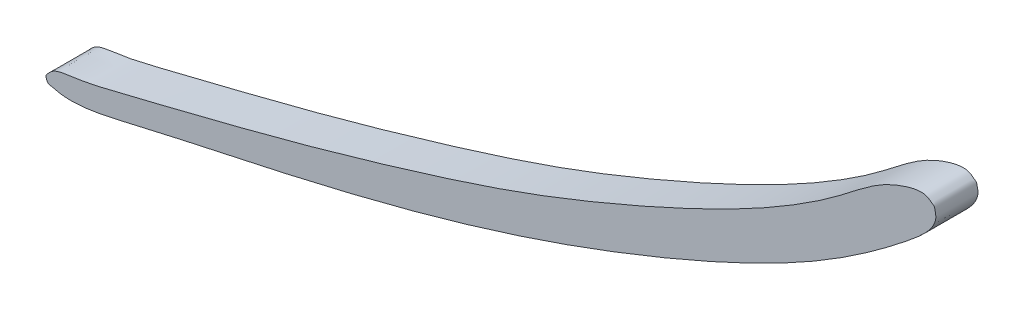
ISO-10303-21;
HEADER;
FILE_DESCRIPTION(('STEP AP214'),'2;1');
FILE_NAME('part.step','',(''),(''),'','','');
FILE_SCHEMA(('AUTOMOTIVE_DESIGN { 1 0 10303 214 1 1 1 1 }'));
ENDSEC;
DATA;
#1=APPLICATION_CONTEXT('core data for automotive mechanical design processes');
#2=APPLICATION_PROTOCOL_DEFINITION('international standard','automotive_design',2000,#1);
#3=PRODUCT_CONTEXT('',#1,'mechanical');
#4=PRODUCT('Part','Part','',(#3));
#5=PRODUCT_RELATED_PRODUCT_CATEGORY('part','',(#4));
#6=PRODUCT_DEFINITION_FORMATION('','',#4);
#7=PRODUCT_DEFINITION_CONTEXT('part definition',#1,'design');
#8=PRODUCT_DEFINITION('design','',#6,#7);
#9=PRODUCT_DEFINITION_SHAPE('','',#8);
#10=(LENGTH_UNIT() NAMED_UNIT(*) SI_UNIT(.MILLI.,.METRE.));
#11=(NAMED_UNIT(*) PLANE_ANGLE_UNIT() SI_UNIT($,.RADIAN.));
#12=(NAMED_UNIT(*) SI_UNIT($,.STERADIAN.) SOLID_ANGLE_UNIT());
#13=UNCERTAINTY_MEASURE_WITH_UNIT(LENGTH_MEASURE(1.E-05),#10,'distance_accuracy_value','');
#14=(GEOMETRIC_REPRESENTATION_CONTEXT(3) GLOBAL_UNCERTAINTY_ASSIGNED_CONTEXT((#13)) GLOBAL_UNIT_ASSIGNED_CONTEXT((#10,
#11,#12)) REPRESENTATION_CONTEXT('',''));
#15=CARTESIAN_POINT('',(0.,0.,0.));
#16=DIRECTION('',(0.,0.,1.));
#17=DIRECTION('',(1.,0.,0.));
#18=AXIS2_PLACEMENT_3D('',#15,#16,#17);
#19=CARTESIAN_POINT('',(95.8761429269694,0.,228.));
#20=CARTESIAN_POINT('',(95.8198608803581,0.108459353381954,228.));
#21=CARTESIAN_POINT('',(95.7282873021874,0.189084031108585,228.));
#22=CARTESIAN_POINT('',(95.539225400978,0.338618990837617,228.));
#23=CARTESIAN_POINT('',(95.4402302304874,0.407322745435094,228.));
#24=CARTESIAN_POINT('',(95.2451858723611,0.548731766905495,228.));
#25=CARTESIAN_POINT('',(95.1488988368261,0.621113966287715,228.));
#26=CARTESIAN_POINT('',(94.9512039482148,0.758922786808325,228.));
#27=CARTESIAN_POINT('',(94.849937761855,0.824408524371955,228.));
#28=CARTESIAN_POINT('',(94.6429754639707,0.944608669012284,228.));
#29=CARTESIAN_POINT('',(94.5369973117123,0.999366883679326,228.));
#30=CARTESIAN_POINT('',(94.3156887921621,1.08887605025863,228.));
#31=CARTESIAN_POINT('',(94.1998650638861,1.12412918514583,228.));
#32=CARTESIAN_POINT('',(93.844951063713,1.20363094378329,228.));
#33=CARTESIAN_POINT('',(93.6062692379634,1.22081672884301,228.));
#34=CARTESIAN_POINT('',(93.1268579399196,1.21980227887352,228.));
#35=CARTESIAN_POINT('',(92.8853339629823,1.20060197255364,228.));
#36=CARTESIAN_POINT('',(92.4094557552646,1.14416397751064,228.));
#37=CARTESIAN_POINT('',(92.1738390549288,1.10654107833428,228.));
#38=CARTESIAN_POINT('',(91.4731906024571,0.968560597969261,228.));
#39=CARTESIAN_POINT('',(91.013944554194,0.844775481606252,228.));
#40=CARTESIAN_POINT('',(89.6471640226288,0.4290504456343,228.));
#41=CARTESIAN_POINT('',(88.7502005796986,0.0851339049369845,228.));
#42=CARTESIAN_POINT('',(87.0212227623803,-0.690946806970216,228.));
#43=CARTESIAN_POINT('',(86.1849892992756,-1.12742412889521,228.));
#44=CARTESIAN_POINT('',(83.7582342582898,-2.57733110649913,228.));
#45=CARTESIAN_POINT('',(82.2433436958476,-3.72163431610041,228.));
#46=CARTESIAN_POINT('',(79.9890365335514,-5.46455720035804,228.));
#47=CARTESIAN_POINT('',(79.2396432072951,-6.04856221210025,228.));
#48=CARTESIAN_POINT('',(77.7288497734147,-7.19875532699036,228.));
#49=CARTESIAN_POINT('',(76.9687005995013,-7.76679969543525,228.));
#50=CARTESIAN_POINT('',(74.6621963890029,-9.43226718109594,228.));
#51=CARTESIAN_POINT('',(73.0895719948963,-10.49070909865,228.));
#52=CARTESIAN_POINT('',(69.8973992330206,-12.5379622705511,228.));
#53=CARTESIAN_POINT('',(68.278239207117,-13.5273497868708,228.));
#54=CARTESIAN_POINT('',(65.0053989615575,-15.4549001725463,228.));
#55=CARTESIAN_POINT('',(63.3507616711095,-16.3923308654961,228.));
#56=CARTESIAN_POINT('',(60.0146437517485,-18.2086078271371,228.));
#57=CARTESIAN_POINT('',(58.3325311663902,-19.0889957927179,228.));
#58=CARTESIAN_POINT('',(53.2536028838856,-21.6658059119303,228.));
#59=CARTESIAN_POINT('',(49.8256609551872,-23.3010794126383,228.));
#60=CARTESIAN_POINT('',(42.9199292514986,-26.4719171961902,228.));
#61=CARTESIAN_POINT('',(39.4429322366847,-28.0040515889737,228.));
#62=CARTESIAN_POINT('',(32.4503642303064,-30.9768444024783,228.));
#63=CARTESIAN_POINT('',(28.9361693957437,-32.4183763527179,228.));
#64=CARTESIAN_POINT('',(21.8620464564048,-35.1868839676796,228.));
#65=CARTESIAN_POINT('',(18.2992985538152,-36.5102689390151,228.));
#66=CARTESIAN_POINT('',(11.1300434531806,-39.025310547925,228.));
#67=CARTESIAN_POINT('',(7.52403679548449,-40.2187934717678,228.));
#68=CARTESIAN_POINT('',(0.285678747198065,-42.5268476591136,228.));
#69=CARTESIAN_POINT('',(-3.34620430452008,-43.6431735827326,228.));
#70=CARTESIAN_POINT('',(-10.6233238749076,-45.8276549765031,228.));
#71=CARTESIAN_POINT('',(-14.268626540786,-46.8970809493043,228.));
#72=CARTESIAN_POINT('',(-21.5769192073913,-48.9760873061703,228.));
#73=CARTESIAN_POINT('',(-25.2399288548139,-49.984600854072,228.));
#74=CARTESIAN_POINT('',(-36.2510291431524,-52.9243934165192,228.));
#75=CARTESIAN_POINT('',(-43.6226055584853,-54.7685497578621,228.));
#76=CARTESIAN_POINT('',(-52.8383775034155,-57.0662728322969,228.));
#77=CARTESIAN_POINT('',(-54.6820250820038,-57.5238563690483,228.));
#78=CARTESIAN_POINT('',(-57.4492261051861,-58.2031759895578,228.));
#79=CARTESIAN_POINT('',(-58.3719201552478,-58.4284189518678,228.));
#80=CARTESIAN_POINT('',(-60.2178658311726,-58.876626622914,228.));
#81=CARTESIAN_POINT('',(-61.1405740499489,-59.101867073282,228.));
#82=CARTESIAN_POINT('',(-62.9895229396463,-59.5371750849887,228.));
#83=CARTESIAN_POINT('',(-63.91701598159,-59.744349006577,228.));
#84=CARTESIAN_POINT('',(-65.3159606650231,-60.0125824156687,228.));
#85=CARTESIAN_POINT('',(-65.7833563293831,-60.0952208929907,228.));
#86=CARTESIAN_POINT('',(-66.7205506904614,-60.2454392129541,228.));
#87=CARTESIAN_POINT('',(-67.1906217527856,-60.3113122728531,228.));
#88=CARTESIAN_POINT('',(-68.1323471678812,-60.4331366817124,228.));
#89=CARTESIAN_POINT('',(-68.6035556725727,-60.4918819436775,228.));
#90=CARTESIAN_POINT('',(-69.5397508856436,-60.6483614381032,228.));
#91=CARTESIAN_POINT('',(-70.0045201956059,-60.7414556004579,228.));
#92=CARTESIAN_POINT('',(-70.680194068326,-60.9563368452897,228.));
#93=CARTESIAN_POINT('',(-70.9036640960618,-61.0422518786921,228.));
#94=CARTESIAN_POINT('',(-71.3288449125255,-61.2544293449905,228.));
#95=CARTESIAN_POINT('',(-71.5264005326576,-61.380914825097,228.));
#96=CARTESIAN_POINT('',(-71.8930174521635,-61.6725422297083,228.));
#97=CARTESIAN_POINT('',(-72.063725239824,-61.8356813630099,228.));
#98=CARTESIAN_POINT('',(-72.3109124661283,-62.0917067297034,228.));
#99=CARTESIAN_POINT('',(-72.3937942107047,-62.1766471800936,228.));
#100=CARTESIAN_POINT('',(-72.5497990198545,-62.3545867519193,228.));
#101=CARTESIAN_POINT('',(-72.62616755203,-62.4460141489739,228.));
#102=CARTESIAN_POINT('',(-72.7009092745034,-62.6126289880025,228.));
#103=CARTESIAN_POINT('',(-72.7163376219334,-62.6706394640711,228.));
#104=CARTESIAN_POINT('',(-72.7268668723558,-62.7919583042064,228.));
#105=CARTESIAN_POINT('',(-72.7228119559879,-62.8524415334632,228.));
#106=CARTESIAN_POINT('',(-72.6943712247098,-63.030952612607,228.));
#107=CARTESIAN_POINT('',(-72.6560913297369,-63.147007383784,228.));
#108=CARTESIAN_POINT('',(-72.5718283411058,-63.3725860672425,228.));
#109=CARTESIAN_POINT('',(-72.5244579446214,-63.4851131477135,228.));
#110=CARTESIAN_POINT('',(-72.3904432249387,-63.686785631947,228.));
#111=CARTESIAN_POINT('',(-72.2971883716435,-63.7706655733251,228.));
#112=CARTESIAN_POINT('',(-72.075786906701,-63.8673385802044,228.));
#113=CARTESIAN_POINT('',(-71.9542744483445,-63.8882528857536,228.));
#114=CARTESIAN_POINT('',(-71.715775070707,-63.9308564261819,228.));
#115=CARTESIAN_POINT('',(-71.5965945107579,-63.9524827898298,228.));
#116=CARTESIAN_POINT('',(-71.2413971179723,-64.0283694408774,228.));
#117=CARTESIAN_POINT('',(-71.0060390153781,-64.0868895186554,228.));
#118=CARTESIAN_POINT('',(-70.5343116466855,-64.1987676529057,228.));
#119=CARTESIAN_POINT('',(-70.2978037898101,-64.2496506812453,228.));
#120=CARTESIAN_POINT('',(-69.8217122983779,-64.3272752997957,228.));
#121=CARTESIAN_POINT('',(-69.5823602810065,-64.3558348276249,228.));
#122=CARTESIAN_POINT('',(-68.8615769793512,-64.4201075317309,228.));
#123=CARTESIAN_POINT('',(-68.3767570677758,-64.4339680505195,228.));
#124=CARTESIAN_POINT('',(-66.9205946633167,-64.431503286543,228.));
#125=CARTESIAN_POINT('',(-65.9570218081596,-64.3610372247123,228.));
#126=CARTESIAN_POINT('',(-64.0401831490131,-64.1216112086203,228.));
#127=CARTESIAN_POINT('',(-63.0860815498497,-63.9550856348498,228.));
#128=CARTESIAN_POINT('',(-61.1845370871905,-63.5852704188049,228.));
#129=CARTESIAN_POINT('',(-60.2378639601407,-63.3799853567075,228.));
#130=CARTESIAN_POINT('',(-58.3475728931344,-62.9562025027494,228.));
#131=CARTESIAN_POINT('',(-57.4038679753597,-62.7380166884657,228.));
#132=CARTESIAN_POINT('',(-54.5735028285301,-62.0801840393881,228.));
#133=CARTESIAN_POINT('',(-52.6865495131159,-61.6418177674978,228.));
#134=CARTESIAN_POINT('',(-47.0183199123226,-60.3589186974827,228.));
#135=CARTESIAN_POINT('',(-43.2310578860864,-59.5416388796518,228.));
#136=CARTESIAN_POINT('',(-35.6572468348173,-57.9043819500331,228.));
#137=CARTESIAN_POINT('',(-31.8706663220072,-57.08430489079,228.));
#138=CARTESIAN_POINT('',(-20.5290092974959,-54.5435538532448,228.));
#139=CARTESIAN_POINT('',(-12.9911506312778,-52.7411041639036,228.));
#140=CARTESIAN_POINT('',(-1.7573198974173,-49.7638602782123,228.));
#141=CARTESIAN_POINT('',(1.97640445918297,-48.7262877190536,228.));
#142=CARTESIAN_POINT('',(9.41296125322026,-46.5509718890261,228.));
#143=CARTESIAN_POINT('',(13.1158468316397,-45.4139904194972,228.));
#144=CARTESIAN_POINT('',(20.4846463106674,-43.0215583024723,228.));
#145=CARTESIAN_POINT('',(24.1516548506785,-41.7664738731307,228.));
#146=CARTESIAN_POINT('',(31.4419883050313,-39.1441081417825,228.));
#147=CARTESIAN_POINT('',(35.0661960657563,-37.7770556611248,228.));
#148=CARTESIAN_POINT('',(42.2739562459899,-34.9345771182171,228.));
#149=CARTESIAN_POINT('',(45.8580145302899,-33.4596768308193,228.));
#150=CARTESIAN_POINT('',(52.973348551253,-30.3962864341949,228.));
#151=CARTESIAN_POINT('',(56.5055065903124,-28.8070253442507,228.));
#152=CARTESIAN_POINT('',(63.4963949930724,-25.4627995171014,228.));
#153=CARTESIAN_POINT('',(66.9517347037497,-23.7076315515114,228.));
#154=CARTESIAN_POINT('',(72.0325408842295,-20.8889596536194,228.));
#155=CARTESIAN_POINT('',(73.710474268731,-19.9179432424359,228.));
#156=CARTESIAN_POINT('',(77.0228935254952,-17.906339460613,228.));
#157=CARTESIAN_POINT('',(78.6572377017682,-16.8663334684758,228.));
#158=CARTESIAN_POINT('',(83.4938910092373,-13.6424785535455,228.));
#159=CARTESIAN_POINT('',(86.6230522467649,-11.3486062280198,228.));
#160=CARTESIAN_POINT('',(90.4302495022829,-8.35149607035129,228.));
#161=CARTESIAN_POINT('',(91.1869439576446,-7.74560647035724,228.));
#162=CARTESIAN_POINT('',(92.3019109239478,-6.81324464978926,228.));
#163=CARTESIAN_POINT('',(92.6694232273071,-6.49756627293581,228.));
#164=CARTESIAN_POINT('',(93.3897754925363,-5.84888925847664,228.));
#165=CARTESIAN_POINT('',(93.7429518355986,-5.51721395126669,228.));
#166=CARTESIAN_POINT('',(94.4164500340719,-4.82493515596019,228.));
#167=CARTESIAN_POINT('',(94.7369659266705,-4.46406986327257,228.));
#168=CARTESIAN_POINT('',(95.1754086012,-3.88437136068866,228.));
#169=CARTESIAN_POINT('',(95.3148665444707,-3.68352312450405,228.));
#170=CARTESIAN_POINT('',(95.5698081077445,-3.26988006003367,228.));
#171=CARTESIAN_POINT('',(95.6851792775976,-3.05697037665441,228.));
#172=CARTESIAN_POINT('',(95.8891109961931,-2.61766073297591,228.));
#173=CARTESIAN_POINT('',(95.9786085278752,-2.38925530656935,228.));
#174=CARTESIAN_POINT('',(96.1072001642054,-1.91959529724832,228.));
#175=CARTESIAN_POINT('',(96.1474804009962,-1.67913461826608,228.));
#176=CARTESIAN_POINT('',(96.1364383603216,-1.18808257707184,228.));
#177=CARTESIAN_POINT('',(96.0816638947303,-0.950323506535479,228.));
#178=CARTESIAN_POINT('',(96.0055442398399,-0.59273210951289,228.));
#179=CARTESIAN_POINT('',(95.9853118212193,-0.472723695998544,228.));
#180=CARTESIAN_POINT('',(95.9569324653922,-0.292399631145835,228.));
#181=CARTESIAN_POINT('',(95.9479544817437,-0.232174499245211,228.));
#182=CARTESIAN_POINT('',(95.9220821754445,-0.113648439617593,228.));
#183=CARTESIAN_POINT('',(95.904283950275,-0.0542296766909688,228.));
#184=CARTESIAN_POINT('',(95.8761429269694,0.,228.));
#185=B_SPLINE_CURVE_WITH_KNOTS('',3,(#19,#20,#21,#22,#23,#24,#25,#26,#27,#28,#29,#30,#31,#32,
#33,#34,#35,#36,#37,#38,#39,#40,#41,#42,#43,#44,#45,#46,#47,#48,#49,#50,#51,#52,#53,#54,#55,#56,
#57,#58,#59,#60,#61,#62,#63,#64,#65,#66,#67,#68,#69,#70,#71,#72,#73,#74,#75,#76,#77,#78,#79,#80,
#81,#82,#83,#84,#85,#86,#87,#88,#89,#90,#91,#92,#93,#94,#95,#96,#97,#98,#99,#100,#101,#102,#103,
#104,#105,#106,#107,#108,#109,#110,#111,#112,#113,#114,#115,#116,#117,#118,#119,#120,#121,#122,
#123,#124,#125,#126,#127,#128,#129,#130,#131,#132,#133,#134,#135,#136,#137,#138,#139,#140,#141,
#142,#143,#144,#145,#146,#147,#148,#149,#150,#151,#152,#153,#154,#155,#156,#157,#158,#159,#160,
#161,#162,#163,#164,#165,#166,#167,#168,#169,#170,#171,#172,#173,#174,#175,#176,#177,#178,#179,
#180,#181,#182,#183,#184),.UNSPECIFIED.,.T.,.F.,(4,2,2,2,2,2,2,2,2,2,2,2,2,2,2,2,2,2,2,2,2,2,2,
2,2,2,2,2,2,2,2,2,2,2,2,2,2,2,2,2,2,2,2,2,2,2,2,2,2,2,2,2,2,2,2,2,2,2,2,2,2,2,2,2,2,2,2,2,2,2,2,
2,2,2,2,2,2,2,2,2,2,2,4),(0.,0.000976562499999938,0.00195312499999988,0.00292968749999981,
0.00390624999999975,0.00488281249999969,0.00585937499999963,0.0078124999999995,
0.00976562499999938,0.0117187499999993,0.0156249999999991,0.0234374999999988,0.0312499999999986,
0.046874999999998,0.0546874999999977,0.0624999999999975,0.0781249999999968,0.0937499999999962,
0.109374999999996,0.124999999999995,0.156249999999994,0.187499999999992,0.218749999999991,
0.24999999999999,0.281249999999989,0.312499999999987,0.343749999999986,0.374999999999985,
0.437499999999982,0.453124999999982,0.460937499999981,0.468749999999981,0.476562499999981,
0.480468749999981,0.48437499999998,0.48828124999998,0.49218749999998,0.49414062499998,
0.49609374999998,0.49804687499998,0.49902343749998,0.49999999999998,0.50048828124998,
0.50097656249998,0.50195312499998,0.50292968749998,0.50390624999998,0.50488281249998,
0.505859374999981,0.507812499999981,0.509765624999981,0.511718749999981,0.515624999999981,
0.523437499999981,0.531249999999981,0.539062499999982,0.546874999999982,0.562499999999983,
0.593749999999984,0.624999999999985,0.687499999999988,0.718749999999989,0.74999999999999,
0.781249999999991,0.812499999999993,0.843749999999994,0.874999999999995,0.906249999999996,
0.921874999999997,0.937499999999998,0.968749999999999,0.976562499999999,0.980468749999999,
0.984374999999999,0.988281249999999,0.990234375,0.9921875,0.994140625,0.99609375,0.998046875,
0.9990234375,0.99951171875,1.),.UNSPECIFIED.);
#186=DIRECTION('',(0.,0.,-1.));
#187=VECTOR('',#186,1.);
#188=SURFACE_OF_LINEAR_EXTRUSION('',#185,#187);
#189=CARTESIAN_POINT('',(95.8761429269694,0.,228.));
#190=CARTESIAN_POINT('',(95.904283950275,-0.0542296766909688,228.));
#191=CARTESIAN_POINT('',(95.9220821754445,-0.113648439617593,228.));
#192=CARTESIAN_POINT('',(95.9479544817437,-0.232174499245211,228.));
#193=CARTESIAN_POINT('',(95.9569324653922,-0.292399631145835,228.));
#194=CARTESIAN_POINT('',(95.9853118212193,-0.472723695998544,228.));
#195=CARTESIAN_POINT('',(96.0055442398399,-0.59273210951289,228.));
#196=CARTESIAN_POINT('',(96.0816638947303,-0.950323506535479,228.));
#197=CARTESIAN_POINT('',(96.1364383603216,-1.18808257707184,228.));
#198=CARTESIAN_POINT('',(96.1474804009962,-1.67913461826608,228.));
#199=CARTESIAN_POINT('',(96.1072001642054,-1.91959529724832,228.));
#200=CARTESIAN_POINT('',(95.9786085278752,-2.38925530656935,228.));
#201=CARTESIAN_POINT('',(95.8891109961931,-2.61766073297591,228.));
#202=CARTESIAN_POINT('',(95.6851792775976,-3.05697037665441,228.));
#203=CARTESIAN_POINT('',(95.5698081077445,-3.26988006003367,228.));
#204=CARTESIAN_POINT('',(95.3148665444707,-3.68352312450405,228.));
#205=CARTESIAN_POINT('',(95.1754086012,-3.88437136068866,228.));
#206=CARTESIAN_POINT('',(94.7369659266705,-4.46406986327257,228.));
#207=CARTESIAN_POINT('',(94.4164500340719,-4.82493515596019,228.));
#208=CARTESIAN_POINT('',(93.7429518355986,-5.51721395126669,228.));
#209=CARTESIAN_POINT('',(93.3897754925363,-5.84888925847664,228.));
#210=CARTESIAN_POINT('',(92.6694232273071,-6.49756627293581,228.));
#211=CARTESIAN_POINT('',(92.3019109239478,-6.81324464978926,228.));
#212=CARTESIAN_POINT('',(91.1869439576446,-7.74560647035724,228.));
#213=CARTESIAN_POINT('',(90.4302495022829,-8.35149607035129,228.));
#214=CARTESIAN_POINT('',(86.6230522467649,-11.3486062280198,228.));
#215=CARTESIAN_POINT('',(83.4938910092373,-13.6424785535455,228.));
#216=CARTESIAN_POINT('',(78.6572377017682,-16.8663334684758,228.));
#217=CARTESIAN_POINT('',(77.0228935254952,-17.906339460613,228.));
#218=CARTESIAN_POINT('',(73.710474268731,-19.9179432424359,228.));
#219=CARTESIAN_POINT('',(72.0325408842295,-20.8889596536194,228.));
#220=CARTESIAN_POINT('',(66.9517347037497,-23.7076315515114,228.));
#221=CARTESIAN_POINT('',(63.4963949930724,-25.4627995171014,228.));
#222=CARTESIAN_POINT('',(56.5055065903124,-28.8070253442507,228.));
#223=CARTESIAN_POINT('',(52.973348551253,-30.3962864341949,228.));
#224=CARTESIAN_POINT('',(45.8580145302899,-33.4596768308193,228.));
#225=CARTESIAN_POINT('',(42.2739562459899,-34.9345771182171,228.));
#226=CARTESIAN_POINT('',(35.0661960657563,-37.7770556611248,228.));
#227=CARTESIAN_POINT('',(31.4419883050313,-39.1441081417825,228.));
#228=CARTESIAN_POINT('',(24.1516548506785,-41.7664738731307,228.));
#229=CARTESIAN_POINT('',(20.4846463106674,-43.0215583024723,228.));
#230=CARTESIAN_POINT('',(13.1158468316397,-45.4139904194972,228.));
#231=CARTESIAN_POINT('',(9.41296125322026,-46.5509718890261,228.));
#232=CARTESIAN_POINT('',(1.97640445918297,-48.7262877190536,228.));
#233=CARTESIAN_POINT('',(-1.7573198974173,-49.7638602782123,228.));
#234=CARTESIAN_POINT('',(-12.9911506312778,-52.7411041639036,228.));
#235=CARTESIAN_POINT('',(-20.5290092974959,-54.5435538532448,228.));
#236=CARTESIAN_POINT('',(-31.8706663220072,-57.08430489079,228.));
#237=CARTESIAN_POINT('',(-35.6572468348173,-57.9043819500331,228.));
#238=CARTESIAN_POINT('',(-43.2310578860864,-59.5416388796518,228.));
#239=CARTESIAN_POINT('',(-47.0183199123226,-60.3589186974827,228.));
#240=CARTESIAN_POINT('',(-52.6865495131159,-61.6418177674978,228.));
#241=CARTESIAN_POINT('',(-54.5735028285301,-62.0801840393881,228.));
#242=CARTESIAN_POINT('',(-57.4038679753597,-62.7380166884657,228.));
#243=CARTESIAN_POINT('',(-58.3475728931344,-62.9562025027494,228.));
#244=CARTESIAN_POINT('',(-60.2378639601407,-63.3799853567075,228.));
#245=CARTESIAN_POINT('',(-61.1845370871905,-63.5852704188049,228.));
#246=CARTESIAN_POINT('',(-63.0860815498497,-63.9550856348498,228.));
#247=CARTESIAN_POINT('',(-64.0401831490131,-64.1216112086203,228.));
#248=CARTESIAN_POINT('',(-65.9570218081596,-64.3610372247123,228.));
#249=CARTESIAN_POINT('',(-66.9205946633167,-64.431503286543,228.));
#250=CARTESIAN_POINT('',(-68.3767570677758,-64.4339680505195,228.));
#251=CARTESIAN_POINT('',(-68.8615769793512,-64.4201075317309,228.));
#252=CARTESIAN_POINT('',(-69.5823602810065,-64.3558348276249,228.));
#253=CARTESIAN_POINT('',(-69.8217122983779,-64.3272752997957,228.));
#254=CARTESIAN_POINT('',(-70.2978037898101,-64.2496506812453,228.));
#255=CARTESIAN_POINT('',(-70.5343116466855,-64.1987676529057,228.));
#256=CARTESIAN_POINT('',(-71.0060390153781,-64.0868895186554,228.));
#257=CARTESIAN_POINT('',(-71.2413971179723,-64.0283694408774,228.));
#258=CARTESIAN_POINT('',(-71.5965945107579,-63.9524827898298,228.));
#259=CARTESIAN_POINT('',(-71.715775070707,-63.9308564261819,228.));
#260=CARTESIAN_POINT('',(-71.9542744483445,-63.8882528857536,228.));
#261=CARTESIAN_POINT('',(-72.075786906701,-63.8673385802044,228.));
#262=CARTESIAN_POINT('',(-72.2971883716435,-63.7706655733251,228.));
#263=CARTESIAN_POINT('',(-72.3904432249387,-63.686785631947,228.));
#264=CARTESIAN_POINT('',(-72.5244579446214,-63.4851131477135,228.));
#265=CARTESIAN_POINT('',(-72.5718283411058,-63.3725860672425,228.));
#266=CARTESIAN_POINT('',(-72.6560913297369,-63.147007383784,228.));
#267=CARTESIAN_POINT('',(-72.6943712247098,-63.030952612607,228.));
#268=CARTESIAN_POINT('',(-72.7228119559879,-62.8524415334632,228.));
#269=CARTESIAN_POINT('',(-72.7268668723558,-62.7919583042064,228.));
#270=CARTESIAN_POINT('',(-72.7163376219334,-62.6706394640711,228.));
#271=CARTESIAN_POINT('',(-72.7009092745034,-62.6126289880025,228.));
#272=CARTESIAN_POINT('',(-72.62616755203,-62.4460141489739,228.));
#273=CARTESIAN_POINT('',(-72.5497990198545,-62.3545867519193,228.));
#274=CARTESIAN_POINT('',(-72.3937942107047,-62.1766471800936,228.));
#275=CARTESIAN_POINT('',(-72.3109124661283,-62.0917067297034,228.));
#276=CARTESIAN_POINT('',(-72.063725239824,-61.8356813630099,228.));
#277=CARTESIAN_POINT('',(-71.8930174521635,-61.6725422297083,228.));
#278=CARTESIAN_POINT('',(-71.5264005326576,-61.380914825097,228.));
#279=CARTESIAN_POINT('',(-71.3288449125255,-61.2544293449905,228.));
#280=CARTESIAN_POINT('',(-70.9036640960618,-61.0422518786921,228.));
#281=CARTESIAN_POINT('',(-70.680194068326,-60.9563368452897,228.));
#282=CARTESIAN_POINT('',(-70.0045201956059,-60.7414556004579,228.));
#283=CARTESIAN_POINT('',(-69.5397508856436,-60.6483614381032,228.));
#284=CARTESIAN_POINT('',(-68.6035556725727,-60.4918819436775,228.));
#285=CARTESIAN_POINT('',(-68.1323471678812,-60.4331366817124,228.));
#286=CARTESIAN_POINT('',(-67.1906217527856,-60.3113122728531,228.));
#287=CARTESIAN_POINT('',(-66.7205506904614,-60.2454392129541,228.));
#288=CARTESIAN_POINT('',(-65.7833563293831,-60.0952208929907,228.));
#289=CARTESIAN_POINT('',(-65.3159606650231,-60.0125824156687,228.));
#290=CARTESIAN_POINT('',(-63.91701598159,-59.744349006577,228.));
#291=CARTESIAN_POINT('',(-62.9895229396463,-59.5371750849887,228.));
#292=CARTESIAN_POINT('',(-61.1405740499489,-59.101867073282,228.));
#293=CARTESIAN_POINT('',(-60.2178658311726,-58.876626622914,228.));
#294=CARTESIAN_POINT('',(-58.3719201552478,-58.4284189518678,228.));
#295=CARTESIAN_POINT('',(-57.4492261051861,-58.2031759895578,228.));
#296=CARTESIAN_POINT('',(-54.6820250820038,-57.5238563690483,228.));
#297=CARTESIAN_POINT('',(-52.8383775034155,-57.0662728322969,228.));
#298=CARTESIAN_POINT('',(-43.6226055584853,-54.7685497578621,228.));
#299=CARTESIAN_POINT('',(-36.2510291431524,-52.9243934165192,228.));
#300=CARTESIAN_POINT('',(-25.2399288548139,-49.984600854072,228.));
#301=CARTESIAN_POINT('',(-21.5769192073913,-48.9760873061703,228.));
#302=CARTESIAN_POINT('',(-14.268626540786,-46.8970809493043,228.));
#303=CARTESIAN_POINT('',(-10.6233238749076,-45.8276549765031,228.));
#304=CARTESIAN_POINT('',(-3.34620430452008,-43.6431735827326,228.));
#305=CARTESIAN_POINT('',(0.285678747198065,-42.5268476591136,228.));
#306=CARTESIAN_POINT('',(7.52403679548449,-40.2187934717678,228.));
#307=CARTESIAN_POINT('',(11.1300434531806,-39.025310547925,228.));
#308=CARTESIAN_POINT('',(18.2992985538152,-36.5102689390151,228.));
#309=CARTESIAN_POINT('',(21.8620464564048,-35.1868839676796,228.));
#310=CARTESIAN_POINT('',(28.9361693957437,-32.4183763527179,228.));
#311=CARTESIAN_POINT('',(32.4503642303064,-30.9768444024783,228.));
#312=CARTESIAN_POINT('',(39.4429322366847,-28.0040515889737,228.));
#313=CARTESIAN_POINT('',(42.9199292514986,-26.4719171961902,228.));
#314=CARTESIAN_POINT('',(49.8256609551872,-23.3010794126383,228.));
#315=CARTESIAN_POINT('',(53.2536028838856,-21.6658059119303,228.));
#316=CARTESIAN_POINT('',(58.3325311663902,-19.0889957927179,228.));
#317=CARTESIAN_POINT('',(60.0146437517485,-18.2086078271371,228.));
#318=CARTESIAN_POINT('',(63.3507616711095,-16.3923308654961,228.));
#319=CARTESIAN_POINT('',(65.0053989615575,-15.4549001725463,228.));
#320=CARTESIAN_POINT('',(68.278239207117,-13.5273497868708,228.));
#321=CARTESIAN_POINT('',(69.8973992330206,-12.5379622705511,228.));
#322=CARTESIAN_POINT('',(73.0895719948963,-10.49070909865,228.));
#323=CARTESIAN_POINT('',(74.6621963890029,-9.43226718109594,228.));
#324=CARTESIAN_POINT('',(76.9687005995013,-7.76679969543525,228.));
#325=CARTESIAN_POINT('',(77.7288497734147,-7.19875532699036,228.));
#326=CARTESIAN_POINT('',(79.2396432072951,-6.04856221210025,228.));
#327=CARTESIAN_POINT('',(79.9890365335514,-5.46455720035804,228.));
#328=CARTESIAN_POINT('',(82.2433436958476,-3.72163431610041,228.));
#329=CARTESIAN_POINT('',(83.7582342582898,-2.57733110649913,228.));
#330=CARTESIAN_POINT('',(86.1849892992756,-1.12742412889521,228.));
#331=CARTESIAN_POINT('',(87.0212227623803,-0.690946806970216,228.));
#332=CARTESIAN_POINT('',(88.7502005796986,0.0851339049369845,228.));
#333=CARTESIAN_POINT('',(89.6471640226288,0.4290504456343,228.));
#334=CARTESIAN_POINT('',(91.013944554194,0.844775481606252,228.));
#335=CARTESIAN_POINT('',(91.4731906024571,0.968560597969261,228.));
#336=CARTESIAN_POINT('',(92.1738390549288,1.10654107833428,228.));
#337=CARTESIAN_POINT('',(92.4094557552646,1.14416397751064,228.));
#338=CARTESIAN_POINT('',(92.8853339629823,1.20060197255364,228.));
#339=CARTESIAN_POINT('',(93.1268579399196,1.21980227887352,228.));
#340=CARTESIAN_POINT('',(93.6062692379634,1.22081672884301,228.));
#341=CARTESIAN_POINT('',(93.844951063713,1.20363094378329,228.));
#342=CARTESIAN_POINT('',(94.1998650638861,1.12412918514583,228.));
#343=CARTESIAN_POINT('',(94.3156887921621,1.08887605025863,228.));
#344=CARTESIAN_POINT('',(94.5369973117123,0.999366883679326,228.));
#345=CARTESIAN_POINT('',(94.6429754639707,0.944608669012284,228.));
#346=CARTESIAN_POINT('',(94.849937761855,0.824408524371955,228.));
#347=CARTESIAN_POINT('',(94.9512039482148,0.758922786808325,228.));
#348=CARTESIAN_POINT('',(95.1488988368261,0.621113966287715,228.));
#349=CARTESIAN_POINT('',(95.2451858723611,0.548731766905495,228.));
#350=CARTESIAN_POINT('',(95.4402302304874,0.407322745435094,228.));
#351=CARTESIAN_POINT('',(95.539225400978,0.338618990837617,228.));
#352=CARTESIAN_POINT('',(95.7282873021874,0.189084031108585,228.));
#353=CARTESIAN_POINT('',(95.8198608803581,0.108459353381954,228.));
#354=CARTESIAN_POINT('',(95.8761429269694,0.,228.));
#355=B_SPLINE_CURVE_WITH_KNOTS('',3,(#189,#190,#191,#192,#193,#194,#195,#196,#197,#198,#199,
#200,#201,#202,#203,#204,#205,#206,#207,#208,#209,#210,#211,#212,#213,#214,#215,#216,#217,#218,
#219,#220,#221,#222,#223,#224,#225,#226,#227,#228,#229,#230,#231,#232,#233,#234,#235,#236,#237,
#238,#239,#240,#241,#242,#243,#244,#245,#246,#247,#248,#249,#250,#251,#252,#253,#254,#255,#256,
#257,#258,#259,#260,#261,#262,#263,#264,#265,#266,#267,#268,#269,#270,#271,#272,#273,#274,#275,
#276,#277,#278,#279,#280,#281,#282,#283,#284,#285,#286,#287,#288,#289,#290,#291,#292,#293,#294,
#295,#296,#297,#298,#299,#300,#301,#302,#303,#304,#305,#306,#307,#308,#309,#310,#311,#312,#313,
#314,#315,#316,#317,#318,#319,#320,#321,#322,#323,#324,#325,#326,#327,#328,#329,#330,#331,#332,
#333,#334,#335,#336,#337,#338,#339,#340,#341,#342,#343,#344,#345,#346,#347,#348,#349,#350,#351,
#352,#353,#354),.UNSPECIFIED.,.T.,.F.,(4,2,2,2,2,2,2,2,2,2,2,2,2,2,2,2,2,2,2,2,2,2,2,2,2,2,2,2,
2,2,2,2,2,2,2,2,2,2,2,2,2,2,2,2,2,2,2,2,2,2,2,2,2,2,2,2,2,2,2,2,2,2,2,2,2,2,2,2,2,2,2,2,2,2,2,2,
2,2,2,2,2,2,4),(0.,0.000488281250000111,0.0009765625,0.00195312500000011,0.00390625000000022,
0.00585937500000033,0.00781250000000044,0.00976562500000044,0.0117187500000006,
0.0156250000000007,0.0195312500000008,0.0234375000000009,0.0312500000000011,0.0625000000000023,
0.078125000000003,0.0937500000000037,0.125000000000005,0.156250000000006,0.187500000000007,
0.218750000000009,0.25000000000001,0.281250000000011,0.312500000000012,0.375000000000015,
0.406250000000016,0.437500000000017,0.453125000000018,0.460937500000018,0.468750000000019,
0.476562500000019,0.484375000000019,0.488281250000019,0.490234375000019,0.492187500000019,
0.494140625000019,0.49511718750002,0.49609375000002,0.49707031250002,0.49804687500002,
0.49902343750002,0.49951171875002,0.50000000000002,0.50097656250002,0.50195312500002,
0.50390625000002,0.50585937500002,0.50781250000002,0.51171875000002,0.51562500000002,
0.519531250000019,0.523437500000019,0.531250000000019,0.539062500000019,0.546875000000018,
0.562500000000018,0.625000000000015,0.656250000000014,0.687500000000013,0.718750000000011,
0.75000000000001,0.781250000000009,0.812500000000008,0.843750000000006,0.875000000000005,
0.890625000000004,0.906250000000004,0.921875000000003,0.937500000000003,0.945312500000002,
0.953125000000002,0.968750000000001,0.976562500000001,0.984375000000001,0.988281250000001,
0.990234375000001,0.9921875,0.994140625,0.9951171875,0.99609375,0.9970703125,0.998046875,
0.9990234375,1.),.UNSPECIFIED.);
#356=CARTESIAN_POINT('',(95.8761429269694,0.,228.));
#357=VERTEX_POINT('',#356);
#358=EDGE_CURVE('E10',#357,#357,#355,.F.);
#359=ORIENTED_EDGE('',*,*,#358,.F.);
#360=EDGE_LOOP('',(#359));
#361=FACE_BOUND('',#360,.T.);
#362=CARTESIAN_POINT('',(95.8761429269694,0.,220.));
#363=CARTESIAN_POINT('',(95.8198608803581,0.108459353381954,220.));
#364=CARTESIAN_POINT('',(95.7282873021874,0.189084031108585,220.));
#365=CARTESIAN_POINT('',(95.539225400978,0.338618990837617,220.));
#366=CARTESIAN_POINT('',(95.4402302304874,0.407322745435094,220.));
#367=CARTESIAN_POINT('',(95.2451858723611,0.548731766905495,220.));
#368=CARTESIAN_POINT('',(95.1488988368261,0.621113966287715,220.));
#369=CARTESIAN_POINT('',(94.9512039482148,0.758922786808325,220.));
#370=CARTESIAN_POINT('',(94.849937761855,0.824408524371955,220.));
#371=CARTESIAN_POINT('',(94.6429754639707,0.944608669012284,220.));
#372=CARTESIAN_POINT('',(94.5369973117123,0.999366883679326,220.));
#373=CARTESIAN_POINT('',(94.3156887921621,1.08887605025863,220.));
#374=CARTESIAN_POINT('',(94.1998650638861,1.12412918514583,220.));
#375=CARTESIAN_POINT('',(93.844951063713,1.20363094378329,220.));
#376=CARTESIAN_POINT('',(93.6062692379634,1.22081672884301,220.));
#377=CARTESIAN_POINT('',(93.1268579399196,1.21980227887352,220.));
#378=CARTESIAN_POINT('',(92.8853339629823,1.20060197255364,220.));
#379=CARTESIAN_POINT('',(92.4094557552646,1.14416397751064,220.));
#380=CARTESIAN_POINT('',(92.1738390549288,1.10654107833428,220.));
#381=CARTESIAN_POINT('',(91.4731906024571,0.968560597969261,220.));
#382=CARTESIAN_POINT('',(91.013944554194,0.844775481606252,220.));
#383=CARTESIAN_POINT('',(89.6471640226288,0.4290504456343,220.));
#384=CARTESIAN_POINT('',(88.7502005796986,0.0851339049369845,220.));
#385=CARTESIAN_POINT('',(87.0212227623803,-0.690946806970216,220.));
#386=CARTESIAN_POINT('',(86.1849892992756,-1.12742412889521,220.));
#387=CARTESIAN_POINT('',(83.7582342582898,-2.57733110649913,220.));
#388=CARTESIAN_POINT('',(82.2433436958476,-3.72163431610041,220.));
#389=CARTESIAN_POINT('',(79.9890365335514,-5.46455720035804,220.));
#390=CARTESIAN_POINT('',(79.2396432072951,-6.04856221210025,220.));
#391=CARTESIAN_POINT('',(77.7288497734147,-7.19875532699036,220.));
#392=CARTESIAN_POINT('',(76.9687005995013,-7.76679969543525,220.));
#393=CARTESIAN_POINT('',(74.6621963890029,-9.43226718109594,220.));
#394=CARTESIAN_POINT('',(73.0895719948963,-10.49070909865,220.));
#395=CARTESIAN_POINT('',(69.8973992330206,-12.5379622705511,220.));
#396=CARTESIAN_POINT('',(68.278239207117,-13.5273497868708,220.));
#397=CARTESIAN_POINT('',(65.0053989615575,-15.4549001725463,220.));
#398=CARTESIAN_POINT('',(63.3507616711095,-16.3923308654961,220.));
#399=CARTESIAN_POINT('',(60.0146437517485,-18.2086078271371,220.));
#400=CARTESIAN_POINT('',(58.3325311663902,-19.0889957927179,220.));
#401=CARTESIAN_POINT('',(53.2536028838856,-21.6658059119303,220.));
#402=CARTESIAN_POINT('',(49.8256609551872,-23.3010794126383,220.));
#403=CARTESIAN_POINT('',(42.9199292514986,-26.4719171961902,220.));
#404=CARTESIAN_POINT('',(39.4429322366847,-28.0040515889737,220.));
#405=CARTESIAN_POINT('',(32.4503642303064,-30.9768444024783,220.));
#406=CARTESIAN_POINT('',(28.9361693957437,-32.4183763527179,220.));
#407=CARTESIAN_POINT('',(21.8620464564048,-35.1868839676796,220.));
#408=CARTESIAN_POINT('',(18.2992985538152,-36.5102689390151,220.));
#409=CARTESIAN_POINT('',(11.1300434531806,-39.025310547925,220.));
#410=CARTESIAN_POINT('',(7.52403679548449,-40.2187934717678,220.));
#411=CARTESIAN_POINT('',(0.285678747198065,-42.5268476591136,220.));
#412=CARTESIAN_POINT('',(-3.34620430452008,-43.6431735827326,220.));
#413=CARTESIAN_POINT('',(-10.6233238749076,-45.8276549765031,220.));
#414=CARTESIAN_POINT('',(-14.268626540786,-46.8970809493043,220.));
#415=CARTESIAN_POINT('',(-21.5769192073913,-48.9760873061703,220.));
#416=CARTESIAN_POINT('',(-25.2399288548139,-49.984600854072,220.));
#417=CARTESIAN_POINT('',(-36.2510291431524,-52.9243934165192,220.));
#418=CARTESIAN_POINT('',(-43.6226055584853,-54.7685497578621,220.));
#419=CARTESIAN_POINT('',(-52.8383775034155,-57.0662728322969,220.));
#420=CARTESIAN_POINT('',(-54.6820250820038,-57.5238563690483,220.));
#421=CARTESIAN_POINT('',(-57.4492261051861,-58.2031759895578,220.));
#422=CARTESIAN_POINT('',(-58.3719201552478,-58.4284189518678,220.));
#423=CARTESIAN_POINT('',(-60.2178658311726,-58.876626622914,220.));
#424=CARTESIAN_POINT('',(-61.1405740499489,-59.101867073282,220.));
#425=CARTESIAN_POINT('',(-62.9895229396463,-59.5371750849887,220.));
#426=CARTESIAN_POINT('',(-63.91701598159,-59.744349006577,220.));
#427=CARTESIAN_POINT('',(-65.3159606650231,-60.0125824156687,220.));
#428=CARTESIAN_POINT('',(-65.7833563293831,-60.0952208929907,220.));
#429=CARTESIAN_POINT('',(-66.7205506904614,-60.2454392129541,220.));
#430=CARTESIAN_POINT('',(-67.1906217527856,-60.3113122728531,220.));
#431=CARTESIAN_POINT('',(-68.1323471678812,-60.4331366817124,220.));
#432=CARTESIAN_POINT('',(-68.6035556725727,-60.4918819436775,220.));
#433=CARTESIAN_POINT('',(-69.5397508856436,-60.6483614381032,220.));
#434=CARTESIAN_POINT('',(-70.0045201956059,-60.7414556004579,220.));
#435=CARTESIAN_POINT('',(-70.680194068326,-60.9563368452897,220.));
#436=CARTESIAN_POINT('',(-70.9036640960618,-61.0422518786921,220.));
#437=CARTESIAN_POINT('',(-71.3288449125255,-61.2544293449905,220.));
#438=CARTESIAN_POINT('',(-71.5264005326576,-61.380914825097,220.));
#439=CARTESIAN_POINT('',(-71.8930174521635,-61.6725422297083,220.));
#440=CARTESIAN_POINT('',(-72.063725239824,-61.8356813630099,220.));
#441=CARTESIAN_POINT('',(-72.3109124661283,-62.0917067297034,220.));
#442=CARTESIAN_POINT('',(-72.3937942107047,-62.1766471800936,220.));
#443=CARTESIAN_POINT('',(-72.5497990198545,-62.3545867519193,220.));
#444=CARTESIAN_POINT('',(-72.62616755203,-62.4460141489739,220.));
#445=CARTESIAN_POINT('',(-72.7009092745034,-62.6126289880025,220.));
#446=CARTESIAN_POINT('',(-72.7163376219334,-62.6706394640711,220.));
#447=CARTESIAN_POINT('',(-72.7268668723558,-62.7919583042064,220.));
#448=CARTESIAN_POINT('',(-72.7228119559879,-62.8524415334632,220.));
#449=CARTESIAN_POINT('',(-72.6943712247098,-63.030952612607,220.));
#450=CARTESIAN_POINT('',(-72.6560913297369,-63.147007383784,220.));
#451=CARTESIAN_POINT('',(-72.5718283411058,-63.3725860672425,220.));
#452=CARTESIAN_POINT('',(-72.5244579446214,-63.4851131477135,220.));
#453=CARTESIAN_POINT('',(-72.3904432249387,-63.686785631947,220.));
#454=CARTESIAN_POINT('',(-72.2971883716435,-63.7706655733251,220.));
#455=CARTESIAN_POINT('',(-72.075786906701,-63.8673385802044,220.));
#456=CARTESIAN_POINT('',(-71.9542744483445,-63.8882528857536,220.));
#457=CARTESIAN_POINT('',(-71.715775070707,-63.9308564261819,220.));
#458=CARTESIAN_POINT('',(-71.5965945107579,-63.9524827898298,220.));
#459=CARTESIAN_POINT('',(-71.2413971179723,-64.0283694408774,220.));
#460=CARTESIAN_POINT('',(-71.0060390153781,-64.0868895186554,220.));
#461=CARTESIAN_POINT('',(-70.5343116466855,-64.1987676529057,220.));
#462=CARTESIAN_POINT('',(-70.2978037898101,-64.2496506812453,220.));
#463=CARTESIAN_POINT('',(-69.8217122983779,-64.3272752997957,220.));
#464=CARTESIAN_POINT('',(-69.5823602810065,-64.3558348276249,220.));
#465=CARTESIAN_POINT('',(-68.8615769793512,-64.4201075317309,220.));
#466=CARTESIAN_POINT('',(-68.3767570677758,-64.4339680505195,220.));
#467=CARTESIAN_POINT('',(-66.9205946633167,-64.431503286543,220.));
#468=CARTESIAN_POINT('',(-65.9570218081596,-64.3610372247123,220.));
#469=CARTESIAN_POINT('',(-64.0401831490131,-64.1216112086203,220.));
#470=CARTESIAN_POINT('',(-63.0860815498497,-63.9550856348498,220.));
#471=CARTESIAN_POINT('',(-61.1845370871905,-63.5852704188049,220.));
#472=CARTESIAN_POINT('',(-60.2378639601407,-63.3799853567075,220.));
#473=CARTESIAN_POINT('',(-58.3475728931344,-62.9562025027494,220.));
#474=CARTESIAN_POINT('',(-57.4038679753597,-62.7380166884657,220.));
#475=CARTESIAN_POINT('',(-54.5735028285301,-62.0801840393881,220.));
#476=CARTESIAN_POINT('',(-52.6865495131159,-61.6418177674978,220.));
#477=CARTESIAN_POINT('',(-47.0183199123226,-60.3589186974827,220.));
#478=CARTESIAN_POINT('',(-43.2310578860864,-59.5416388796518,220.));
#479=CARTESIAN_POINT('',(-35.6572468348173,-57.9043819500331,220.));
#480=CARTESIAN_POINT('',(-31.8706663220072,-57.08430489079,220.));
#481=CARTESIAN_POINT('',(-20.5290092974959,-54.5435538532448,220.));
#482=CARTESIAN_POINT('',(-12.9911506312778,-52.7411041639036,220.));
#483=CARTESIAN_POINT('',(-1.7573198974173,-49.7638602782123,220.));
#484=CARTESIAN_POINT('',(1.97640445918297,-48.7262877190536,220.));
#485=CARTESIAN_POINT('',(9.41296125322026,-46.5509718890261,220.));
#486=CARTESIAN_POINT('',(13.1158468316397,-45.4139904194972,220.));
#487=CARTESIAN_POINT('',(20.4846463106674,-43.0215583024723,220.));
#488=CARTESIAN_POINT('',(24.1516548506785,-41.7664738731307,220.));
#489=CARTESIAN_POINT('',(31.4419883050313,-39.1441081417825,220.));
#490=CARTESIAN_POINT('',(35.0661960657563,-37.7770556611248,220.));
#491=CARTESIAN_POINT('',(42.2739562459899,-34.9345771182171,220.));
#492=CARTESIAN_POINT('',(45.8580145302899,-33.4596768308193,220.));
#493=CARTESIAN_POINT('',(52.973348551253,-30.3962864341949,220.));
#494=CARTESIAN_POINT('',(56.5055065903124,-28.8070253442507,220.));
#495=CARTESIAN_POINT('',(63.4963949930724,-25.4627995171014,220.));
#496=CARTESIAN_POINT('',(66.9517347037497,-23.7076315515114,220.));
#497=CARTESIAN_POINT('',(72.0325408842295,-20.8889596536194,220.));
#498=CARTESIAN_POINT('',(73.710474268731,-19.9179432424359,220.));
#499=CARTESIAN_POINT('',(77.0228935254952,-17.906339460613,220.));
#500=CARTESIAN_POINT('',(78.6572377017682,-16.8663334684758,220.));
#501=CARTESIAN_POINT('',(83.4938910092373,-13.6424785535455,220.));
#502=CARTESIAN_POINT('',(86.6230522467649,-11.3486062280198,220.));
#503=CARTESIAN_POINT('',(90.4302495022829,-8.35149607035129,220.));
#504=CARTESIAN_POINT('',(91.1869439576446,-7.74560647035724,220.));
#505=CARTESIAN_POINT('',(92.3019109239478,-6.81324464978926,220.));
#506=CARTESIAN_POINT('',(92.6694232273071,-6.49756627293581,220.));
#507=CARTESIAN_POINT('',(93.3897754925363,-5.84888925847664,220.));
#508=CARTESIAN_POINT('',(93.7429518355986,-5.51721395126669,220.));
#509=CARTESIAN_POINT('',(94.4164500340719,-4.82493515596019,220.));
#510=CARTESIAN_POINT('',(94.7369659266705,-4.46406986327257,220.));
#511=CARTESIAN_POINT('',(95.1754086012,-3.88437136068866,220.));
#512=CARTESIAN_POINT('',(95.3148665444707,-3.68352312450405,220.));
#513=CARTESIAN_POINT('',(95.5698081077445,-3.26988006003367,220.));
#514=CARTESIAN_POINT('',(95.6851792775976,-3.05697037665441,220.));
#515=CARTESIAN_POINT('',(95.8891109961931,-2.61766073297591,220.));
#516=CARTESIAN_POINT('',(95.9786085278752,-2.38925530656935,220.));
#517=CARTESIAN_POINT('',(96.1072001642054,-1.91959529724832,220.));
#518=CARTESIAN_POINT('',(96.1474804009962,-1.67913461826608,220.));
#519=CARTESIAN_POINT('',(96.1364383603216,-1.18808257707184,220.));
#520=CARTESIAN_POINT('',(96.0816638947303,-0.950323506535479,220.));
#521=CARTESIAN_POINT('',(96.0055442398399,-0.59273210951289,220.));
#522=CARTESIAN_POINT('',(95.9853118212193,-0.472723695998544,220.));
#523=CARTESIAN_POINT('',(95.9569324653922,-0.292399631145835,220.));
#524=CARTESIAN_POINT('',(95.9479544817437,-0.232174499245211,220.));
#525=CARTESIAN_POINT('',(95.9220821754445,-0.113648439617593,220.));
#526=CARTESIAN_POINT('',(95.904283950275,-0.0542296766909688,220.));
#527=CARTESIAN_POINT('',(95.8761429269694,0.,220.));
#528=B_SPLINE_CURVE_WITH_KNOTS('',3,(#362,#363,#364,#365,#366,#367,#368,#369,#370,#371,#372,
#373,#374,#375,#376,#377,#378,#379,#380,#381,#382,#383,#384,#385,#386,#387,#388,#389,#390,#391,
#392,#393,#394,#395,#396,#397,#398,#399,#400,#401,#402,#403,#404,#405,#406,#407,#408,#409,#410,
#411,#412,#413,#414,#415,#416,#417,#418,#419,#420,#421,#422,#423,#424,#425,#426,#427,#428,#429,
#430,#431,#432,#433,#434,#435,#436,#437,#438,#439,#440,#441,#442,#443,#444,#445,#446,#447,#448,
#449,#450,#451,#452,#453,#454,#455,#456,#457,#458,#459,#460,#461,#462,#463,#464,#465,#466,#467,
#468,#469,#470,#471,#472,#473,#474,#475,#476,#477,#478,#479,#480,#481,#482,#483,#484,#485,#486,
#487,#488,#489,#490,#491,#492,#493,#494,#495,#496,#497,#498,#499,#500,#501,#502,#503,#504,#505,
#506,#507,#508,#509,#510,#511,#512,#513,#514,#515,#516,#517,#518,#519,#520,#521,#522,#523,#524,
#525,#526,#527),.UNSPECIFIED.,.T.,.F.,(4,2,2,2,2,2,2,2,2,2,2,2,2,2,2,2,2,2,2,2,2,2,2,2,2,2,2,2,
2,2,2,2,2,2,2,2,2,2,2,2,2,2,2,2,2,2,2,2,2,2,2,2,2,2,2,2,2,2,2,2,2,2,2,2,2,2,2,2,2,2,2,2,2,2,2,2,
2,2,2,2,2,2,4),(0.,0.000976562499999938,0.00195312499999988,0.00292968749999981,
0.00390624999999975,0.00488281249999969,0.00585937499999963,0.0078124999999995,
0.00976562499999938,0.0117187499999993,0.0156249999999991,0.0234374999999988,0.0312499999999986,
0.046874999999998,0.0546874999999977,0.0624999999999975,0.0781249999999968,0.0937499999999962,
0.109374999999996,0.124999999999995,0.156249999999994,0.187499999999992,0.218749999999991,
0.24999999999999,0.281249999999989,0.312499999999987,0.343749999999986,0.374999999999985,
0.437499999999982,0.453124999999982,0.460937499999981,0.468749999999981,0.476562499999981,
0.480468749999981,0.48437499999998,0.48828124999998,0.49218749999998,0.49414062499998,
0.49609374999998,0.49804687499998,0.49902343749998,0.49999999999998,0.50048828124998,
0.50097656249998,0.50195312499998,0.50292968749998,0.50390624999998,0.50488281249998,
0.505859374999981,0.507812499999981,0.509765624999981,0.511718749999981,0.515624999999981,
0.523437499999981,0.531249999999981,0.539062499999982,0.546874999999982,0.562499999999983,
0.593749999999984,0.624999999999985,0.687499999999988,0.718749999999989,0.74999999999999,
0.781249999999991,0.812499999999993,0.843749999999994,0.874999999999995,0.906249999999996,
0.921874999999997,0.937499999999998,0.968749999999999,0.976562499999999,0.980468749999999,
0.984374999999999,0.988281249999999,0.990234375,0.9921875,0.994140625,0.99609375,0.998046875,
0.9990234375,0.99951171875,1.),.UNSPECIFIED.);
#529=CARTESIAN_POINT('',(95.8761429269694,0.,220.));
#530=VERTEX_POINT('',#529);
#531=EDGE_CURVE('E38',#530,#530,#528,.T.);
#532=ORIENTED_EDGE('',*,*,#531,.T.);
#533=EDGE_LOOP('',(#532));
#534=FACE_BOUND('',#533,.T.);
#535=ADVANCED_FACE('F28',(#361,#534),#188,.F.);
#536=CARTESIAN_POINT('',(-72.6759953670154,-62.5570907083332,228.));
#537=DIRECTION('',(0.,0.,-1.));
#538=DIRECTION('',(-1.,0.,0.));
#539=AXIS2_PLACEMENT_3D('',#536,#537,#538);
#540=PLANE('',#539);
#541=ORIENTED_EDGE('',*,*,#358,.T.);
#542=EDGE_LOOP('',(#541));
#543=FACE_BOUND('',#542,.T.);
#544=ADVANCED_FACE('F69',(#543),#540,.F.);
#545=CARTESIAN_POINT('',(-72.6759953670154,-62.5570907083332,220.));
#546=DIRECTION('',(0.,0.,-1.));
#547=DIRECTION('',(-1.,0.,0.));
#548=AXIS2_PLACEMENT_3D('',#545,#546,#547);
#549=PLANE('',#548);
#550=ORIENTED_EDGE('',*,*,#531,.F.);
#551=EDGE_LOOP('',(#550));
#552=FACE_BOUND('',#551,.T.);
#553=ADVANCED_FACE('F77',(#552),#549,.T.);
#554=CLOSED_SHELL('',(#535,#544,#553));
#555=MANIFOLD_SOLID_BREP('B2',#554);
#556=ADVANCED_BREP_SHAPE_REPRESENTATION('',(#18,#555),#14);
#557=SHAPE_DEFINITION_REPRESENTATION(#9,#556);
ENDSEC;
END-ISO-10303-21;
